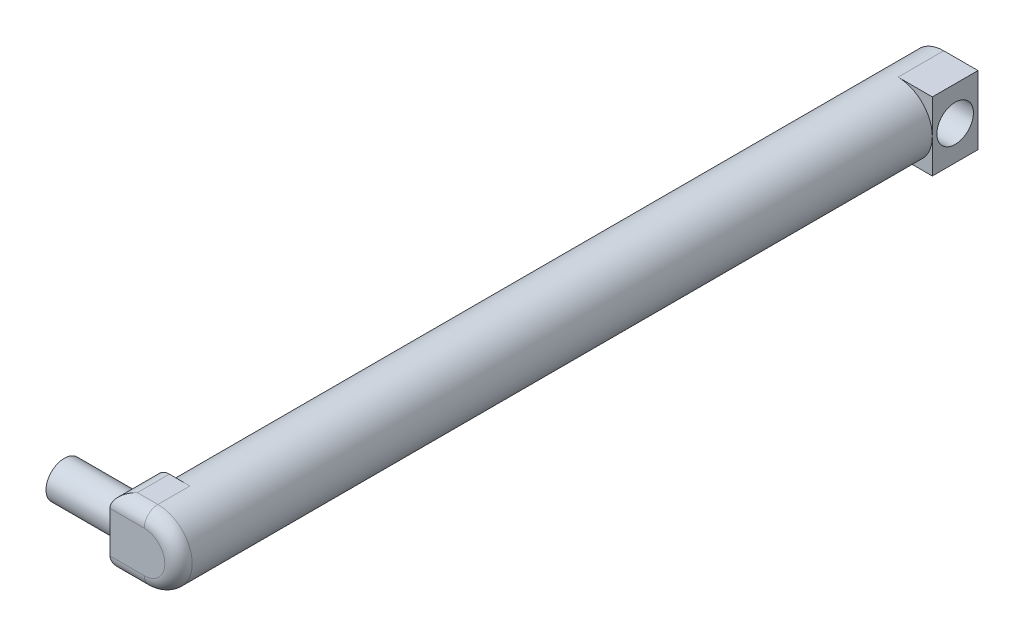
ISO-10303-21;
HEADER;
FILE_DESCRIPTION(('STEP AP214'),'2;1');
FILE_NAME('part.step','',(''),(''),'','','');
FILE_SCHEMA(('AUTOMOTIVE_DESIGN { 1 0 10303 214 1 1 1 1 }'));
ENDSEC;
DATA;
#1=APPLICATION_CONTEXT('core data for automotive mechanical design processes');
#2=APPLICATION_PROTOCOL_DEFINITION('international standard','automotive_design',2000,#1);
#3=PRODUCT_CONTEXT('',#1,'mechanical');
#4=PRODUCT('Part','Part','',(#3));
#5=PRODUCT_RELATED_PRODUCT_CATEGORY('part','',(#4));
#6=PRODUCT_DEFINITION_FORMATION('','',#4);
#7=PRODUCT_DEFINITION_CONTEXT('part definition',#1,'design');
#8=PRODUCT_DEFINITION('design','',#6,#7);
#9=PRODUCT_DEFINITION_SHAPE('','',#8);
#10=(LENGTH_UNIT() NAMED_UNIT(*) SI_UNIT(.MILLI.,.METRE.));
#11=(NAMED_UNIT(*) PLANE_ANGLE_UNIT() SI_UNIT($,.RADIAN.));
#12=(NAMED_UNIT(*) SI_UNIT($,.STERADIAN.) SOLID_ANGLE_UNIT());
#13=UNCERTAINTY_MEASURE_WITH_UNIT(LENGTH_MEASURE(1.E-05),#10,'distance_accuracy_value','');
#14=(GEOMETRIC_REPRESENTATION_CONTEXT(3) GLOBAL_UNCERTAINTY_ASSIGNED_CONTEXT((#13)) GLOBAL_UNIT_ASSIGNED_CONTEXT((#10,
#11,#12)) REPRESENTATION_CONTEXT('',''));
#15=CARTESIAN_POINT('',(0.,0.,0.));
#16=DIRECTION('',(0.,0.,1.));
#17=DIRECTION('',(1.,0.,0.));
#18=AXIS2_PLACEMENT_3D('',#15,#16,#17);
#19=CARTESIAN_POINT('',(0.,0.,87.5));
#20=DIRECTION('',(0.,0.,-1.));
#21=DIRECTION('',(-1.,0.,0.));
#22=AXIS2_PLACEMENT_3D('',#19,#20,#21);
#23=CYLINDRICAL_SURFACE('',#22,7.5);
#24=CARTESIAN_POINT('',(-7.5,0.,-86.5));
#25=CARTESIAN_POINT('',(-7.5000003565888,0.104329282062199,-86.5000004046588));
#26=CARTESIAN_POINT('',(-7.49781838733206,0.20865297315055,-86.4959139359064));
#27=CARTESIAN_POINT('',(-7.48914792809085,0.416519532694102,-86.4796211144569));
#28=CARTESIAN_POINT('',(-7.48265795809276,0.520062120433034,-86.4674119712118));
#29=CARTESIAN_POINT('',(-7.46552494325476,0.725661755814319,-86.4350036110173));
#30=CARTESIAN_POINT('',(-7.45487726156821,0.82771701244696,-86.4147954729225));
#31=CARTESIAN_POINT('',(-7.429702302448,1.02950974372243,-86.3666381219506));
#32=CARTESIAN_POINT('',(-7.41517343993482,1.12924625325474,-86.3386857461429));
#33=CARTESIAN_POINT('',(-7.36641110389997,1.42307484957279,-86.2439272176739));
#34=CARTESIAN_POINT('',(-7.32690726435782,1.61285610439798,-86.1660473286318));
#35=CARTESIAN_POINT('',(-7.23738512882497,1.97620882807869,-85.9836808418298));
#36=CARTESIAN_POINT('',(-7.18736678511962,2.14978022336897,-85.8791941233281));
#37=CARTESIAN_POINT('',(-7.07739524144995,2.48882838647984,-85.6387413185248));
#38=CARTESIAN_POINT('',(-7.01700391293028,2.65301196117544,-85.5011511022639));
#39=CARTESIAN_POINT('',(-6.89435393756057,2.95716832786104,-85.2019951611751));
#40=CARTESIAN_POINT('',(-6.83209371093265,3.09711991939475,-85.0404086693895));
#41=CARTESIAN_POINT('',(-6.70609881897042,3.36178904411128,-84.6800631097044));
#42=CARTESIAN_POINT('',(-6.64274760403001,3.48395288901692,-84.4792578315556));
#43=CARTESIAN_POINT('',(-6.55766590278403,3.64013044094552,-84.1623374324653));
#44=CARTESIAN_POINT('',(-6.53095573212732,3.68768940370648,-84.0540404723391));
#45=CARTESIAN_POINT('',(-6.48188273561665,3.77327802817909,-83.8328202813905));
#46=CARTESIAN_POINT('',(-6.45951718006276,3.8113136777099,-83.719900009729));
#47=CARTESIAN_POINT('',(-6.42132989472233,3.87528400019101,-83.4973663662737));
#48=CARTESIAN_POINT('',(-6.40518874932017,3.90182208154813,-83.3879811020633));
#49=CARTESIAN_POINT('',(-6.37828721584859,3.94564516953517,-83.1667721752918));
#50=CARTESIAN_POINT('',(-6.36752377044962,3.9629354341283,-83.0549499360264));
#51=CARTESIAN_POINT('',(-6.35187091381487,3.98797639174461,-82.8299235838271));
#52=CARTESIAN_POINT('',(-6.3469766762784,3.99573492292375,-82.7167206837181));
#53=CARTESIAN_POINT('',(-6.34328425161274,4.00159448104057,-82.4899733052857));
#54=CARTESIAN_POINT('',(-6.3444853257355,3.99969667831996,-82.376428870023));
#55=CARTESIAN_POINT('',(-6.35232566303532,3.98722972170294,-82.1661195048184));
#56=CARTESIAN_POINT('',(-6.35817365977643,3.9779219198866,-82.0692476341147));
#57=CARTESIAN_POINT('',(-6.37410335700423,3.95234427787245,-81.8767703731256));
#58=CARTESIAN_POINT('',(-6.38418636032666,3.93607229522044,-81.7811653819208));
#59=CARTESIAN_POINT('',(-6.42031483252746,3.87707963352284,-81.4972327402971));
#60=CARTESIAN_POINT('',(-6.45224517517567,3.82417439658882,-81.3116603971578));
#61=CARTESIAN_POINT('',(-6.52881406724507,3.69194831950791,-80.9482808345653));
#62=CARTESIAN_POINT('',(-6.57372199699013,3.61206074230911,-80.7707417196264));
#63=CARTESIAN_POINT('',(-6.67125272734225,3.42858159672857,-80.4306591361637));
#64=CARTESIAN_POINT('',(-6.72387894293752,3.32497952433164,-80.2681223576233));
#65=CARTESIAN_POINT('',(-6.84022433430245,3.07935066182909,-79.9375729654779));
#66=CARTESIAN_POINT('',(-6.90443725265664,2.93391468067228,-79.7722649804824));
#67=CARTESIAN_POINT('',(-7.0305856578553,2.6172236218036,-79.4671045434941));
#68=CARTESIAN_POINT('',(-7.09251973666539,2.44595290399302,-79.3272676254219));
#69=CARTESIAN_POINT('',(-7.18091003196548,2.16676749561537,-79.1356406737895));
#70=CARTESIAN_POINT('',(-7.21036936496574,2.06686725357391,-79.0733399581302));
#71=CARTESIAN_POINT('',(-7.26614530584493,1.86130318636215,-78.9574795298745));
#72=CARTESIAN_POINT('',(-7.29246325067824,1.75564184117329,-78.9039160951644));
#73=CARTESIAN_POINT('',(-7.34117979399002,1.53927716521096,-78.8061244571584));
#74=CARTESIAN_POINT('',(-7.36358023569822,1.42857623668727,-78.7618918615655));
#75=CARTESIAN_POINT('',(-7.40379052971811,1.20291776465836,-78.6832925005316));
#76=CARTESIAN_POINT('',(-7.42160099228095,1.08796078933366,-78.6489244235047));
#77=CARTESIAN_POINT('',(-7.45068973934004,0.865261981590673,-78.5931739951133));
#78=CARTESIAN_POINT('',(-7.46241120917736,0.757800134366426,-78.5709022213946));
#79=CARTESIAN_POINT('',(-7.48125196145415,0.54101896148851,-78.5352350386694));
#80=CARTESIAN_POINT('',(-7.48837172870756,0.431699832755216,-78.5218386945852));
#81=CARTESIAN_POINT('',(-7.49780284977591,0.212172445332399,-78.5041141213842));
#82=CARTESIAN_POINT('',(-7.50011642228208,0.101964620491306,-78.499781708064));
#83=CARTESIAN_POINT('',(-7.4998745492101,-0.118422298726799,-78.500235220401));
#84=CARTESIAN_POINT('',(-7.49731938183728,-0.228601394385634,-78.5050206250556));
#85=CARTESIAN_POINT('',(-7.48786549189285,-0.437982802231482,-78.522792332344));
#86=CARTESIAN_POINT('',(-7.48138330516566,-0.537271395324438,-78.5349925121782));
#87=CARTESIAN_POINT('',(-7.46461842778939,-0.734354419367284,-78.5667185720399));
#88=CARTESIAN_POINT('',(-7.4543345490593,-0.832148373262246,-78.5862467421938));
#89=CARTESIAN_POINT('',(-7.41811350898023,-1.12223852607949,-78.6555220471351));
#90=CARTESIAN_POINT('',(-7.38679785832797,-1.31143028545916,-78.715976310537));
#91=CARTESIAN_POINT('',(-7.31162738394122,-1.68128124536846,-78.8648791336522));
#92=CARTESIAN_POINT('',(-7.26747936309653,-1.86161005009195,-78.9539881513407));
#93=CARTESIAN_POINT('',(-7.1706722892615,-2.20530240057119,-79.1568737939862));
#94=CARTESIAN_POINT('',(-7.11800991704562,-2.36865928905232,-79.2706600450191));
#95=CARTESIAN_POINT('',(-7.00238186003331,-2.69245168004452,-79.5337278678554));
#96=CARTESIAN_POINT('',(-6.93891733052565,-2.85067860830199,-79.6855121913655));
#97=CARTESIAN_POINT('',(-6.8126367428886,-3.14054502606931,-80.0130503115271));
#98=CARTESIAN_POINT('',(-6.74982133612403,-3.27215988416869,-80.1888260642724));
#99=CARTESIAN_POINT('',(-6.62747054435041,-3.51371844657841,-80.5741875336133));
#100=CARTESIAN_POINT('',(-6.56844065039287,-3.62160676699385,-80.7852527257999));
#101=CARTESIAN_POINT('',(-6.49262165424052,-3.75479280356835,-81.1159144975398));
#102=CARTESIAN_POINT('',(-6.46947070545892,-3.79441212065732,-81.2284714227621));
#103=CARTESIAN_POINT('',(-6.42837188034774,-3.86363310205601,-81.4575831638266));
#104=CARTESIAN_POINT('',(-6.41042307765894,-3.89323655007399,-81.5741372637429));
#105=CARTESIAN_POINT('',(-6.38206607548851,-3.93952982764856,-81.7986232341008));
#106=CARTESIAN_POINT('',(-6.37109180814434,-3.9571999417056,-81.906282571544));
#107=CARTESIAN_POINT('',(-6.35455615174192,-3.98369950475512,-82.1230908358025));
#108=CARTESIAN_POINT('',(-6.34899400830872,-3.99253018584676,-82.2322395528676));
#109=CARTESIAN_POINT('',(-6.343537194496,-4.00119558261889,-82.4509823731155));
#110=CARTESIAN_POINT('',(-6.34363942734213,-4.00103521380076,-82.5605762001803));
#111=CARTESIAN_POINT('',(-6.34948650875654,-3.99174615325387,-82.7791972773478));
#112=CARTESIAN_POINT('',(-6.3552309854964,-3.98261805250587,-82.8882245643101));
#113=CARTESIAN_POINT('',(-6.37853289312993,-3.94527417873186,-83.1865949721952));
#114=CARTESIAN_POINT('',(-6.40173425966461,-3.90785104919342,-83.3744376507201));
#115=CARTESIAN_POINT('',(-6.46192910198025,-3.80746909076307,-83.7407066042789));
#116=CARTESIAN_POINT('',(-6.49892769226506,-3.74450079175035,-83.9191293594002));
#117=CARTESIAN_POINT('',(-6.58538478583849,-3.59040170279546,-84.274512838411));
#118=CARTESIAN_POINT('',(-6.63549242982026,-3.4977179608066,-84.450638887825));
#119=CARTESIAN_POINT('',(-6.74169802608887,-3.28835420868506,-84.7860136301835));
#120=CARTESIAN_POINT('',(-6.7977991959768,-3.1716612778753,-84.9452531653403));
#121=CARTESIAN_POINT('',(-6.91936180564218,-2.89792689416131,-85.2663600454207));
#122=CARTESIAN_POINT('',(-6.98500336547952,-2.73749066322366,-85.4252756143717));
#123=CARTESIAN_POINT('',(-7.11114874133997,-2.39071522740848,-85.7148794522795));
#124=CARTESIAN_POINT('',(-7.17164921605034,-2.20435938107369,-85.8455494476468));
#125=CARTESIAN_POINT('',(-7.2545091697502,-1.906087713759,-86.018596659601));
#126=CARTESIAN_POINT('',(-7.28108999394949,-1.8021405141934,-86.0729731804958));
#127=CARTESIAN_POINT('',(-7.33051892919403,-1.58915491745256,-86.1726541432577));
#128=CARTESIAN_POINT('',(-7.35336887642075,-1.48011905888512,-86.2179630503181));
#129=CARTESIAN_POINT('',(-7.39461358306138,-1.25794839965551,-86.298883804249));
#130=CARTESIAN_POINT('',(-7.4130172964941,-1.14482237349216,-86.3345151584879));
#131=CARTESIAN_POINT('',(-7.44484645657042,-0.915246729077317,-86.3956928143055));
#132=CARTESIAN_POINT('',(-7.45827466304437,-0.798798992046856,-86.4212447073022));
#133=CARTESIAN_POINT('',(-7.47922653543234,-0.569078137569122,-86.4609467900112));
#134=CARTESIAN_POINT('',(-7.48699590056285,-0.455909474433897,-86.4755722451431));
#135=CARTESIAN_POINT('',(-7.49738246839363,-0.228491648148601,-86.4950986866838));
#136=CARTESIAN_POINT('',(-7.49999960952874,-0.114242472103614,-86.4999995568912));
#137=CARTESIAN_POINT('',(-7.5,0.,-86.5));
#138=B_SPLINE_CURVE_WITH_KNOTS('',3,(#24,#25,#26,#27,#28,#29,#30,#31,#32,#33,#34,#35,#36,#37,
#38,#39,#40,#41,#42,#43,#44,#45,#46,#47,#48,#49,#50,#51,#52,#53,#54,#55,#56,#57,#58,#59,#60,#61,
#62,#63,#64,#65,#66,#67,#68,#69,#70,#71,#72,#73,#74,#75,#76,#77,#78,#79,#80,#81,#82,#83,#84,#85,
#86,#87,#88,#89,#90,#91,#92,#93,#94,#95,#96,#97,#98,#99,#100,#101,#102,#103,#104,#105,#106,#107,
#108,#109,#110,#111,#112,#113,#114,#115,#116,#117,#118,#119,#120,#121,#122,#123,#124,#125,#126,
#127,#128,#129,#130,#131,#132,#133,#134,#135,#136,#137),.UNSPECIFIED.,.T.,.F.,(4,2,2,2,2,2,2,2,
2,2,2,2,2,2,2,2,2,2,2,2,2,2,2,2,2,2,2,2,2,2,2,2,2,2,2,2,2,2,2,2,2,2,2,2,2,2,2,2,2,2,2,2,2,2,2,2,
4),(0.,0.312875469479015,0.62585848299281,0.939191549226759,1.25265277726732,1.87635275152567,
2.50005555618564,3.16498046195741,3.83048419996534,4.55668682890166,4.92002643777439,
5.28313701854146,5.62376635161279,5.9642018091377,6.30435713124204,6.64447122771346,
6.93659372254513,7.22880615034373,7.81285364987978,8.41002203259999,9.00745543658762,
9.69267368662066,10.3783084384646,10.7419894504042,11.1055151259852,11.4688692957185,
11.832175131501,12.1628321135778,12.4934542534944,12.8239237338457,13.1543743313613,
13.4547461604999,13.7552119394292,14.3555858590258,14.9709302919497,15.5865151910734,
16.2683843198732,16.9508817080033,17.6793249173507,18.0434998556508,18.407609904506,
18.736085199439,19.0645147029147,19.3927646522843,19.720992971169,20.2969971418722,
20.8732150446115,21.4865540202389,22.1002239350291,22.8026614959087,23.5055521504617,
23.865983572286,24.2262370666406,24.5857589036965,24.9450810204139,25.2876812883866,
25.6302856501472),.UNSPECIFIED.);
#139=CARTESIAN_POINT('',(-7.5,0.,-86.5));
#140=VERTEX_POINT('',#139);
#141=EDGE_CURVE('E230',#140,#140,#138,.T.);
#142=ORIENTED_EDGE('',*,*,#141,.T.);
#143=EDGE_LOOP('',(#142));
#144=FACE_BOUND('',#143,.T.);
#145=DIRECTION('',(0.,0.,1.));
#146=VECTOR('',#145,1.);
#147=CARTESIAN_POINT('',(0.,7.5,87.5));
#148=LINE('',#147,#146);
#149=CARTESIAN_POINT('',(0.,7.5,77.5));
#150=VERTEX_POINT('',#149);
#151=CARTESIAN_POINT('',(0.,7.5,84.5));
#152=VERTEX_POINT('',#151);
#153=EDGE_CURVE('E172',#150,#152,#148,.T.);
#154=ORIENTED_EDGE('',*,*,#153,.T.);
#155=CARTESIAN_POINT('',(0.,0.,84.5));
#156=DIRECTION('',(0.,0.,1.));
#157=DIRECTION('',(1.,0.,0.));
#158=AXIS2_PLACEMENT_3D('',#155,#156,#157);
#159=CIRCLE('',#158,7.5);
#160=CARTESIAN_POINT('',(0.,-7.5,84.5));
#161=VERTEX_POINT('',#160);
#162=EDGE_CURVE('E199',#152,#161,#159,.F.);
#163=ORIENTED_EDGE('',*,*,#162,.T.);
#164=DIRECTION('',(0.,0.,-1.));
#165=VECTOR('',#164,1.);
#166=CARTESIAN_POINT('',(0.,-7.5,87.5));
#167=LINE('',#166,#165);
#168=CARTESIAN_POINT('',(0.,-7.5,77.5));
#169=VERTEX_POINT('',#168);
#170=EDGE_CURVE('E166',#161,#169,#167,.T.);
#171=ORIENTED_EDGE('',*,*,#170,.T.);
#172=CARTESIAN_POINT('',(0.,0.,77.5));
#173=DIRECTION('',(0.,0.,-1.));
#174=DIRECTION('',(0.,1.,0.));
#175=AXIS2_PLACEMENT_3D('',#172,#173,#174);
#176=CIRCLE('',#175,7.5);
#177=CARTESIAN_POINT('',(-7.5,0.,77.5));
#178=VERTEX_POINT('',#177);
#179=EDGE_CURVE('E184',#169,#178,#176,.T.);
#180=ORIENTED_EDGE('',*,*,#179,.T.);
#181=EDGE_CURVE('E187',#178,#150,#176,.T.);
#182=ORIENTED_EDGE('',*,*,#181,.T.);
#183=EDGE_LOOP('',(#154,#163,#171,#180,#182));
#184=FACE_BOUND('',#183,.T.);
#185=CARTESIAN_POINT('',(0.,0.,-77.5));
#186=DIRECTION('',(0.,0.,-1.));
#187=DIRECTION('',(-1.,0.,0.));
#188=AXIS2_PLACEMENT_3D('',#185,#186,#187);
#189=CIRCLE('',#188,7.5);
#190=CARTESIAN_POINT('',(7.5,0.,-77.5));
#191=VERTEX_POINT('',#190);
#192=CARTESIAN_POINT('',(0.,-7.5,-77.5));
#193=VERTEX_POINT('',#192);
#194=EDGE_CURVE('E191',#191,#193,#189,.T.);
#195=ORIENTED_EDGE('',*,*,#194,.F.);
#196=CARTESIAN_POINT('',(0.,7.5,-77.5));
#197=VERTEX_POINT('',#196);
#198=EDGE_CURVE('E188',#197,#191,#189,.T.);
#199=ORIENTED_EDGE('',*,*,#198,.F.);
#200=DIRECTION('',(0.,0.,1.));
#201=VECTOR('',#200,1.);
#202=CARTESIAN_POINT('',(0.,7.5,-87.5));
#203=LINE('',#202,#201);
#204=CARTESIAN_POINT('',(0.,7.5,-87.5));
#205=VERTEX_POINT('',#204);
#206=EDGE_CURVE('E235',#205,#197,#203,.T.);
#207=ORIENTED_EDGE('',*,*,#206,.F.);
#208=CARTESIAN_POINT('',(0.,0.,-87.5));
#209=DIRECTION('',(0.,0.,1.));
#210=DIRECTION('',(1.,0.,0.));
#211=AXIS2_PLACEMENT_3D('',#208,#209,#210);
#212=CIRCLE('',#211,7.5);
#213=CARTESIAN_POINT('',(0.,-7.5,-87.5));
#214=VERTEX_POINT('',#213);
#215=EDGE_CURVE('E155',#205,#214,#212,.T.);
#216=ORIENTED_EDGE('',*,*,#215,.T.);
#217=DIRECTION('',(0.,0.,-1.));
#218=VECTOR('',#217,1.);
#219=CARTESIAN_POINT('',(0.,-7.5,-87.5));
#220=LINE('',#219,#218);
#221=EDGE_CURVE('E141',#193,#214,#220,.T.);
#222=ORIENTED_EDGE('',*,*,#221,.F.);
#223=EDGE_LOOP('',(#195,#199,#207,#216,#222));
#224=FACE_BOUND('',#223,.T.);
#225=ADVANCED_FACE('F41',(#144,#184,#224),#23,.T.);
#226=CARTESIAN_POINT('',(0.,0.,87.5));
#227=DIRECTION('',(0.,0.,1.));
#228=DIRECTION('',(1.,0.,0.));
#229=AXIS2_PLACEMENT_3D('',#226,#227,#228);
#230=PLANE('',#229);
#231=DIRECTION('',(0.,-1.,0.));
#232=VECTOR('',#231,1.);
#233=CARTESIAN_POINT('',(-7.5,-7.5,87.5));
#234=LINE('',#233,#232);
#235=CARTESIAN_POINT('',(-7.5,4.5,87.5));
#236=VERTEX_POINT('',#235);
#237=CARTESIAN_POINT('',(-7.5,-4.5,87.5));
#238=VERTEX_POINT('',#237);
#239=EDGE_CURVE('E168',#236,#238,#234,.T.);
#240=ORIENTED_EDGE('',*,*,#239,.T.);
#241=DIRECTION('',(1.,0.,0.));
#242=VECTOR('',#241,1.);
#243=CARTESIAN_POINT('',(0.,-4.5,87.5));
#244=LINE('',#243,#242);
#245=CARTESIAN_POINT('',(0.,-4.5,87.5));
#246=VERTEX_POINT('',#245);
#247=EDGE_CURVE('E197',#238,#246,#244,.T.);
#248=ORIENTED_EDGE('',*,*,#247,.T.);
#249=CARTESIAN_POINT('',(0.,0.,87.5));
#250=DIRECTION('',(0.,0.,1.));
#251=DIRECTION('',(1.,0.,0.));
#252=AXIS2_PLACEMENT_3D('',#249,#250,#251);
#253=CIRCLE('',#252,4.5);
#254=CARTESIAN_POINT('',(0.,4.5,87.5));
#255=VERTEX_POINT('',#254);
#256=EDGE_CURVE('E194',#246,#255,#253,.T.);
#257=ORIENTED_EDGE('',*,*,#256,.T.);
#258=DIRECTION('',(1.,0.,0.));
#259=VECTOR('',#258,1.);
#260=CARTESIAN_POINT('',(0.,4.5,87.5));
#261=LINE('',#260,#259);
#262=EDGE_CURVE('E192',#255,#236,#261,.F.);
#263=ORIENTED_EDGE('',*,*,#262,.T.);
#264=EDGE_LOOP('',(#240,#248,#257,#263));
#265=FACE_BOUND('',#264,.T.);
#266=ADVANCED_FACE('F286',(#265),#230,.T.);
#267=CARTESIAN_POINT('',(0.,0.,-87.5));
#268=DIRECTION('',(0.,0.,1.));
#269=DIRECTION('',(1.,0.,0.));
#270=AXIS2_PLACEMENT_3D('',#267,#268,#269);
#271=PLANE('',#270);
#272=ORIENTED_EDGE('',*,*,#215,.F.);
#273=DIRECTION('',(-1.,0.,0.));
#274=VECTOR('',#273,1.);
#275=CARTESIAN_POINT('',(7.5,7.5,-87.5));
#276=LINE('',#275,#274);
#277=CARTESIAN_POINT('',(7.5,7.5,-87.5));
#278=VERTEX_POINT('',#277);
#279=EDGE_CURVE('E147',#278,#205,#276,.T.);
#280=ORIENTED_EDGE('',*,*,#279,.F.);
#281=DIRECTION('',(0.,1.,0.));
#282=VECTOR('',#281,1.);
#283=CARTESIAN_POINT('',(7.5,-7.5,-87.5));
#284=LINE('',#283,#282);
#285=CARTESIAN_POINT('',(7.5,-7.5,-87.5));
#286=VERTEX_POINT('',#285);
#287=EDGE_CURVE('E129',#286,#278,#284,.T.);
#288=ORIENTED_EDGE('',*,*,#287,.F.);
#289=DIRECTION('',(-1.,0.,0.));
#290=VECTOR('',#289,1.);
#291=CARTESIAN_POINT('',(7.5,-7.5,-87.5));
#292=LINE('',#291,#290);
#293=EDGE_CURVE('E313',#286,#214,#292,.T.);
#294=ORIENTED_EDGE('',*,*,#293,.T.);
#295=EDGE_LOOP('',(#272,#280,#288,#294));
#296=FACE_BOUND('',#295,.T.);
#297=ADVANCED_FACE('F154',(#296),#271,.F.);
#298=CARTESIAN_POINT('',(-7.5,-7.5,77.5));
#299=DIRECTION('',(0.,0.,-1.));
#300=DIRECTION('',(0.,1.,0.));
#301=AXIS2_PLACEMENT_3D('',#298,#299,#300);
#302=PLANE('',#301);
#303=DIRECTION('',(1.,0.,0.));
#304=VECTOR('',#303,1.);
#305=CARTESIAN_POINT('',(-7.5,-7.5,77.5));
#306=LINE('',#305,#304);
#307=CARTESIAN_POINT('',(-4.5,-7.5,77.5));
#308=VERTEX_POINT('',#307);
#309=EDGE_CURVE('E175',#308,#169,#306,.T.);
#310=ORIENTED_EDGE('',*,*,#309,.F.);
#311=CARTESIAN_POINT('',(-4.5,-4.5,77.5));
#312=DIRECTION('',(0.,0.,-1.));
#313=DIRECTION('',(0.,1.,0.));
#314=AXIS2_PLACEMENT_3D('',#311,#312,#313);
#315=CIRCLE('',#314,3.);
#316=CARTESIAN_POINT('',(-7.5,-4.5,77.5));
#317=VERTEX_POINT('',#316);
#318=EDGE_CURVE('E205',#308,#317,#315,.T.);
#319=ORIENTED_EDGE('',*,*,#318,.T.);
#320=DIRECTION('',(0.,1.,0.));
#321=VECTOR('',#320,1.);
#322=CARTESIAN_POINT('',(-7.5,-7.5,77.5));
#323=LINE('',#322,#321);
#324=EDGE_CURVE('E173',#317,#178,#323,.T.);
#325=ORIENTED_EDGE('',*,*,#324,.T.);
#326=ORIENTED_EDGE('',*,*,#179,.F.);
#327=EDGE_LOOP('',(#310,#319,#325,#326));
#328=FACE_BOUND('',#327,.T.);
#329=ADVANCED_FACE('F276',(#328),#302,.T.);
#330=CARTESIAN_POINT('',(-7.5,0.,0.));
#331=DIRECTION('',(-1.,0.,0.));
#332=DIRECTION('',(0.,0.,1.));
#333=AXIS2_PLACEMENT_3D('',#330,#331,#332);
#334=PLANE('',#333);
#335=CARTESIAN_POINT('',(-7.5,0.,82.5));
#336=DIRECTION('',(-1.,0.,0.));
#337=DIRECTION('',(0.,0.,1.));
#338=AXIS2_PLACEMENT_3D('',#335,#336,#337);
#339=CIRCLE('',#338,4.00000000000001);
#340=CARTESIAN_POINT('',(-7.5,0.,86.5));
#341=VERTEX_POINT('',#340);
#342=EDGE_CURVE('E156',#341,#341,#339,.T.);
#343=ORIENTED_EDGE('',*,*,#342,.F.);
#344=EDGE_LOOP('',(#343));
#345=FACE_BOUND('',#344,.T.);
#346=ORIENTED_EDGE('',*,*,#324,.F.);
#347=DIRECTION('',(0.,0.,-1.));
#348=VECTOR('',#347,1.);
#349=CARTESIAN_POINT('',(-7.5,-4.5,0.));
#350=LINE('',#349,#348);
#351=EDGE_CURVE('E209',#317,#238,#350,.F.);
#352=ORIENTED_EDGE('',*,*,#351,.T.);
#353=ORIENTED_EDGE('',*,*,#239,.F.);
#354=DIRECTION('',(0.,0.,1.));
#355=VECTOR('',#354,1.);
#356=CARTESIAN_POINT('',(-7.5,4.5,0.));
#357=LINE('',#356,#355);
#358=CARTESIAN_POINT('',(-7.5,4.5,77.5));
#359=VERTEX_POINT('',#358);
#360=EDGE_CURVE('E207',#236,#359,#357,.F.);
#361=ORIENTED_EDGE('',*,*,#360,.T.);
#362=EDGE_CURVE('E171',#178,#359,#323,.T.);
#363=ORIENTED_EDGE('',*,*,#362,.F.);
#364=EDGE_LOOP('',(#346,#352,#353,#361,#363));
#365=FACE_BOUND('',#364,.T.);
#366=ADVANCED_FACE('F272',(#345,#365),#334,.T.);
#367=CARTESIAN_POINT('',(-7.5,7.5,87.5));
#368=DIRECTION('',(0.,1.,0.));
#369=DIRECTION('',(0.,0.,1.));
#370=AXIS2_PLACEMENT_3D('',#367,#368,#369);
#371=PLANE('',#370);
#372=DIRECTION('',(1.,0.,0.));
#373=VECTOR('',#372,1.);
#374=CARTESIAN_POINT('',(-7.5,7.5,77.5));
#375=LINE('',#374,#373);
#376=CARTESIAN_POINT('',(-4.5,7.5,77.5));
#377=VERTEX_POINT('',#376);
#378=EDGE_CURVE('E180',#377,#150,#375,.T.);
#379=ORIENTED_EDGE('',*,*,#378,.F.);
#380=DIRECTION('',(0.,0.,1.));
#381=VECTOR('',#380,1.);
#382=CARTESIAN_POINT('',(-4.5,7.5,87.5));
#383=LINE('',#382,#381);
#384=CARTESIAN_POINT('',(-4.5,7.5,84.5));
#385=VERTEX_POINT('',#384);
#386=EDGE_CURVE('E50',#377,#385,#383,.T.);
#387=ORIENTED_EDGE('',*,*,#386,.T.);
#388=DIRECTION('',(1.,0.,0.));
#389=VECTOR('',#388,1.);
#390=CARTESIAN_POINT('',(-7.5,7.5,84.5));
#391=LINE('',#390,#389);
#392=EDGE_CURVE('E211',#385,#152,#391,.T.);
#393=ORIENTED_EDGE('',*,*,#392,.T.);
#394=ORIENTED_EDGE('',*,*,#153,.F.);
#395=EDGE_LOOP('',(#379,#387,#393,#394));
#396=FACE_BOUND('',#395,.T.);
#397=ADVANCED_FACE('F275',(#396),#371,.T.);
#398=ORIENTED_EDGE('',*,*,#362,.T.);
#399=CARTESIAN_POINT('',(-4.5,4.5,77.5));
#400=DIRECTION('',(0.,0.,-1.));
#401=DIRECTION('',(0.,1.,0.));
#402=AXIS2_PLACEMENT_3D('',#399,#400,#401);
#403=CIRCLE('',#402,3.);
#404=EDGE_CURVE('E11',#359,#377,#403,.T.);
#405=ORIENTED_EDGE('',*,*,#404,.T.);
#406=ORIENTED_EDGE('',*,*,#378,.T.);
#407=ORIENTED_EDGE('',*,*,#181,.F.);
#408=EDGE_LOOP('',(#398,#405,#406,#407));
#409=FACE_BOUND('',#408,.T.);
#410=ADVANCED_FACE('F280',(#409),#302,.T.);
#411=CARTESIAN_POINT('',(-7.5,-7.5,87.5));
#412=DIRECTION('',(0.,-1.,0.));
#413=DIRECTION('',(0.,0.,-1.));
#414=AXIS2_PLACEMENT_3D('',#411,#412,#413);
#415=PLANE('',#414);
#416=DIRECTION('',(1.,0.,0.));
#417=VECTOR('',#416,1.);
#418=CARTESIAN_POINT('',(-7.5,-7.5,84.5));
#419=LINE('',#418,#417);
#420=CARTESIAN_POINT('',(-4.5,-7.5,84.5));
#421=VERTEX_POINT('',#420);
#422=EDGE_CURVE('E201',#161,#421,#419,.F.);
#423=ORIENTED_EDGE('',*,*,#422,.T.);
#424=DIRECTION('',(0.,0.,-1.));
#425=VECTOR('',#424,1.);
#426=CARTESIAN_POINT('',(-4.5,-7.5,87.5));
#427=LINE('',#426,#425);
#428=EDGE_CURVE('E203',#421,#308,#427,.T.);
#429=ORIENTED_EDGE('',*,*,#428,.T.);
#430=ORIENTED_EDGE('',*,*,#309,.T.);
#431=ORIENTED_EDGE('',*,*,#170,.F.);
#432=EDGE_LOOP('',(#423,#429,#430,#431));
#433=FACE_BOUND('',#432,.T.);
#434=ADVANCED_FACE('F270',(#433),#415,.T.);
#435=CARTESIAN_POINT('',(-22.5,0.,82.5));
#436=DIRECTION('',(1.,0.,0.));
#437=DIRECTION('',(0.,0.,-1.));
#438=AXIS2_PLACEMENT_3D('',#435,#436,#437);
#439=CYLINDRICAL_SURFACE('',#438,4.00000000000001);
#440=CARTESIAN_POINT('',(-22.5,0.,82.5));
#441=DIRECTION('',(-1.,0.,0.));
#442=DIRECTION('',(0.,0.,1.));
#443=AXIS2_PLACEMENT_3D('',#440,#441,#442);
#444=CIRCLE('',#443,4.00000000000001);
#445=CARTESIAN_POINT('',(-22.5,0.,86.5));
#446=VERTEX_POINT('',#445);
#447=EDGE_CURVE('E159',#446,#446,#444,.T.);
#448=ORIENTED_EDGE('',*,*,#447,.F.);
#449=EDGE_LOOP('',(#448));
#450=FACE_BOUND('',#449,.T.);
#451=ORIENTED_EDGE('',*,*,#342,.T.);
#452=EDGE_LOOP('',(#451));
#453=FACE_BOUND('',#452,.T.);
#454=ADVANCED_FACE('F266',(#450,#453),#439,.T.);
#455=CARTESIAN_POINT('',(-22.5,0.,82.5));
#456=DIRECTION('',(-1.,0.,0.));
#457=DIRECTION('',(0.,0.,1.));
#458=AXIS2_PLACEMENT_3D('',#455,#456,#457);
#459=PLANE('',#458);
#460=ORIENTED_EDGE('',*,*,#447,.T.);
#461=EDGE_LOOP('',(#460));
#462=FACE_BOUND('',#461,.T.);
#463=ADVANCED_FACE('F263',(#462),#459,.T.);
#464=CARTESIAN_POINT('',(7.5,-7.5,-77.5));
#465=DIRECTION('',(0.,0.,-1.));
#466=DIRECTION('',(-1.,0.,0.));
#467=AXIS2_PLACEMENT_3D('',#464,#465,#466);
#468=PLANE('',#467);
#469=DIRECTION('',(-1.,0.,0.));
#470=VECTOR('',#469,1.);
#471=CARTESIAN_POINT('',(7.5,7.5,-77.5));
#472=LINE('',#471,#470);
#473=CARTESIAN_POINT('',(7.5,7.5,-77.5));
#474=VERTEX_POINT('',#473);
#475=EDGE_CURVE('E149',#474,#197,#472,.T.);
#476=ORIENTED_EDGE('',*,*,#475,.T.);
#477=ORIENTED_EDGE('',*,*,#198,.T.);
#478=DIRECTION('',(0.,-1.,0.));
#479=VECTOR('',#478,1.);
#480=CARTESIAN_POINT('',(7.5,-7.5,-77.5));
#481=LINE('',#480,#479);
#482=EDGE_CURVE('E311',#474,#191,#481,.T.);
#483=ORIENTED_EDGE('',*,*,#482,.F.);
#484=EDGE_LOOP('',(#476,#477,#483));
#485=FACE_BOUND('',#484,.T.);
#486=ADVANCED_FACE('F252',(#485),#468,.F.);
#487=CARTESIAN_POINT('',(7.5,0.,0.));
#488=DIRECTION('',(1.,0.,0.));
#489=DIRECTION('',(0.,0.,-1.));
#490=AXIS2_PLACEMENT_3D('',#487,#488,#489);
#491=PLANE('',#490);
#492=CARTESIAN_POINT('',(7.5,0.,-82.5));
#493=DIRECTION('',(1.,0.,0.));
#494=DIRECTION('',(0.,0.,-1.));
#495=AXIS2_PLACEMENT_3D('',#492,#493,#494);
#496=CIRCLE('',#495,4.00000000000001);
#497=CARTESIAN_POINT('',(7.5,0.,-86.5));
#498=VERTEX_POINT('',#497);
#499=EDGE_CURVE('E224',#498,#498,#496,.T.);
#500=ORIENTED_EDGE('',*,*,#499,.F.);
#501=EDGE_LOOP('',(#500));
#502=FACE_BOUND('',#501,.T.);
#503=ORIENTED_EDGE('',*,*,#287,.T.);
#504=DIRECTION('',(0.,0.,1.));
#505=VECTOR('',#504,1.);
#506=CARTESIAN_POINT('',(7.5,7.5,-87.5));
#507=LINE('',#506,#505);
#508=EDGE_CURVE('E133',#278,#474,#507,.T.);
#509=ORIENTED_EDGE('',*,*,#508,.T.);
#510=ORIENTED_EDGE('',*,*,#482,.T.);
#511=CARTESIAN_POINT('',(7.5,-7.5,-77.5));
#512=VERTEX_POINT('',#511);
#513=EDGE_CURVE('E151',#191,#512,#481,.T.);
#514=ORIENTED_EDGE('',*,*,#513,.T.);
#515=DIRECTION('',(0.,0.,-1.));
#516=VECTOR('',#515,1.);
#517=CARTESIAN_POINT('',(7.5,-7.5,-87.5));
#518=LINE('',#517,#516);
#519=EDGE_CURVE('E136',#512,#286,#518,.T.);
#520=ORIENTED_EDGE('',*,*,#519,.T.);
#521=EDGE_LOOP('',(#503,#509,#510,#514,#520));
#522=FACE_BOUND('',#521,.T.);
#523=ADVANCED_FACE('F131',(#502,#522),#491,.T.);
#524=CARTESIAN_POINT('',(7.5,7.5,-87.5));
#525=DIRECTION('',(0.,-1.,0.));
#526=DIRECTION('',(0.,0.,-1.));
#527=AXIS2_PLACEMENT_3D('',#524,#525,#526);
#528=PLANE('',#527);
#529=ORIENTED_EDGE('',*,*,#206,.T.);
#530=ORIENTED_EDGE('',*,*,#475,.F.);
#531=ORIENTED_EDGE('',*,*,#508,.F.);
#532=ORIENTED_EDGE('',*,*,#279,.T.);
#533=EDGE_LOOP('',(#529,#530,#531,#532));
#534=FACE_BOUND('',#533,.T.);
#535=ADVANCED_FACE('F146',(#534),#528,.F.);
#536=ORIENTED_EDGE('',*,*,#513,.F.);
#537=ORIENTED_EDGE('',*,*,#194,.T.);
#538=DIRECTION('',(-1.,0.,0.));
#539=VECTOR('',#538,1.);
#540=CARTESIAN_POINT('',(7.5,-7.5,-77.5));
#541=LINE('',#540,#539);
#542=EDGE_CURVE('E161',#512,#193,#541,.T.);
#543=ORIENTED_EDGE('',*,*,#542,.F.);
#544=EDGE_LOOP('',(#536,#537,#543));
#545=FACE_BOUND('',#544,.T.);
#546=ADVANCED_FACE('F256',(#545),#468,.F.);
#547=CARTESIAN_POINT('',(7.5,-7.5,-87.5));
#548=DIRECTION('',(0.,1.,0.));
#549=DIRECTION('',(0.,0.,1.));
#550=AXIS2_PLACEMENT_3D('',#547,#548,#549);
#551=PLANE('',#550);
#552=ORIENTED_EDGE('',*,*,#221,.T.);
#553=ORIENTED_EDGE('',*,*,#293,.F.);
#554=ORIENTED_EDGE('',*,*,#519,.F.);
#555=ORIENTED_EDGE('',*,*,#542,.T.);
#556=EDGE_LOOP('',(#552,#553,#554,#555));
#557=FACE_BOUND('',#556,.T.);
#558=ADVANCED_FACE('F249',(#557),#551,.F.);
#559=CARTESIAN_POINT('',(-7.5,0.,-82.5));
#560=DIRECTION('',(1.,0.,0.));
#561=DIRECTION('',(0.,0.,-1.));
#562=AXIS2_PLACEMENT_3D('',#559,#560,#561);
#563=CYLINDRICAL_SURFACE('',#562,4.00000000000001);
#564=ORIENTED_EDGE('',*,*,#499,.T.);
#565=EDGE_LOOP('',(#564));
#566=FACE_BOUND('',#565,.T.);
#567=ORIENTED_EDGE('',*,*,#141,.F.);
#568=EDGE_LOOP('',(#567));
#569=FACE_BOUND('',#568,.T.);
#570=ADVANCED_FACE('F245',(#566,#569),#563,.F.);
#571=CARTESIAN_POINT('',(-4.5,-4.5,87.5));
#572=DIRECTION('',(0.,0.,-1.));
#573=DIRECTION('',(-1.,0.,0.));
#574=AXIS2_PLACEMENT_3D('',#571,#572,#573);
#575=CYLINDRICAL_SURFACE('',#574,3.);
#576=ORIENTED_EDGE('',*,*,#318,.F.);
#577=ORIENTED_EDGE('',*,*,#428,.F.);
#578=CARTESIAN_POINT('',(-4.5,-4.5,84.5));
#579=DIRECTION('',(0.707106781186547,0.,0.707106781186547));
#580=DIRECTION('',(0.707106781186547,0.,-0.707106781186547));
#581=AXIS2_PLACEMENT_3D('',#578,#579,#580);
#582=ELLIPSE('',#581,4.24264068711928,3.);
#583=EDGE_CURVE('E45',#238,#421,#582,.T.);
#584=ORIENTED_EDGE('',*,*,#583,.F.);
#585=ORIENTED_EDGE('',*,*,#351,.F.);
#586=EDGE_LOOP('',(#576,#577,#584,#585));
#587=FACE_BOUND('',#586,.T.);
#588=ADVANCED_FACE('F43',(#587),#575,.T.);
#589=CARTESIAN_POINT('',(-4.5,4.5,87.5));
#590=DIRECTION('',(0.,0.,1.));
#591=DIRECTION('',(1.,0.,0.));
#592=AXIS2_PLACEMENT_3D('',#589,#590,#591);
#593=CYLINDRICAL_SURFACE('',#592,3.);
#594=ORIENTED_EDGE('',*,*,#404,.F.);
#595=ORIENTED_EDGE('',*,*,#360,.F.);
#596=CARTESIAN_POINT('',(-4.5,4.5,84.5));
#597=DIRECTION('',(0.707106781186547,0.,0.707106781186547));
#598=DIRECTION('',(0.707106781186547,0.,-0.707106781186547));
#599=AXIS2_PLACEMENT_3D('',#596,#597,#598);
#600=ELLIPSE('',#599,4.24264068711928,3.);
#601=EDGE_CURVE('E218',#385,#236,#600,.T.);
#602=ORIENTED_EDGE('',*,*,#601,.F.);
#603=ORIENTED_EDGE('',*,*,#386,.F.);
#604=EDGE_LOOP('',(#594,#595,#602,#603));
#605=FACE_BOUND('',#604,.T.);
#606=ADVANCED_FACE('F355',(#605),#593,.T.);
#607=CARTESIAN_POINT('',(0.,-4.5,84.5));
#608=DIRECTION('',(1.,0.,0.));
#609=DIRECTION('',(0.,0.,-1.));
#610=AXIS2_PLACEMENT_3D('',#607,#608,#609);
#611=CYLINDRICAL_SURFACE('',#610,3.);
#612=ORIENTED_EDGE('',*,*,#583,.T.);
#613=ORIENTED_EDGE('',*,*,#422,.F.);
#614=CARTESIAN_POINT('',(0.,-4.5,84.5));
#615=DIRECTION('',(1.,0.,0.));
#616=DIRECTION('',(0.,0.,-1.));
#617=AXIS2_PLACEMENT_3D('',#614,#615,#616);
#618=CIRCLE('',#617,3.);
#619=EDGE_CURVE('E216',#246,#161,#618,.T.);
#620=ORIENTED_EDGE('',*,*,#619,.F.);
#621=ORIENTED_EDGE('',*,*,#247,.F.);
#622=EDGE_LOOP('',(#612,#613,#620,#621));
#623=FACE_BOUND('',#622,.T.);
#624=ADVANCED_FACE('F364',(#623),#611,.T.);
#625=CARTESIAN_POINT('',(-7.5,4.5,84.5));
#626=DIRECTION('',(1.,0.,0.));
#627=DIRECTION('',(0.,0.,-1.));
#628=AXIS2_PLACEMENT_3D('',#625,#626,#627);
#629=CYLINDRICAL_SURFACE('',#628,3.);
#630=ORIENTED_EDGE('',*,*,#601,.T.);
#631=ORIENTED_EDGE('',*,*,#262,.F.);
#632=CARTESIAN_POINT('',(0.,4.5,84.5));
#633=DIRECTION('',(1.,0.,0.));
#634=DIRECTION('',(0.,0.,-1.));
#635=AXIS2_PLACEMENT_3D('',#632,#633,#634);
#636=CIRCLE('',#635,3.);
#637=EDGE_CURVE('E214',#152,#255,#636,.T.);
#638=ORIENTED_EDGE('',*,*,#637,.F.);
#639=ORIENTED_EDGE('',*,*,#392,.F.);
#640=EDGE_LOOP('',(#630,#631,#638,#639));
#641=FACE_BOUND('',#640,.T.);
#642=ADVANCED_FACE('F373',(#641),#629,.T.);
#643=CARTESIAN_POINT('',(0.,0.,84.5));
#644=DIRECTION('',(0.,0.,1.));
#645=DIRECTION('',(1.,0.,0.));
#646=AXIS2_PLACEMENT_3D('',#643,#644,#645);
#647=TOROIDAL_SURFACE('',#646,4.5,3.);
#648=ORIENTED_EDGE('',*,*,#619,.T.);
#649=ORIENTED_EDGE('',*,*,#162,.F.);
#650=ORIENTED_EDGE('',*,*,#637,.T.);
#651=ORIENTED_EDGE('',*,*,#256,.F.);
#652=EDGE_LOOP('',(#648,#649,#650,#651));
#653=FACE_BOUND('',#652,.T.);
#654=ADVANCED_FACE('F382',(#653),#647,.T.);
#655=CLOSED_SHELL('',(#225,#266,#297,#329,#366,#397,#410,#434,#454,#463,#486,#523,#535,#546,
#558,#570,#588,#606,#624,#642,#654));
#656=MANIFOLD_SOLID_BREP('B2',#655);
#657=ADVANCED_BREP_SHAPE_REPRESENTATION('',(#18,#656),#14);
#658=SHAPE_DEFINITION_REPRESENTATION(#9,#657);
ENDSEC;
END-ISO-10303-21;
